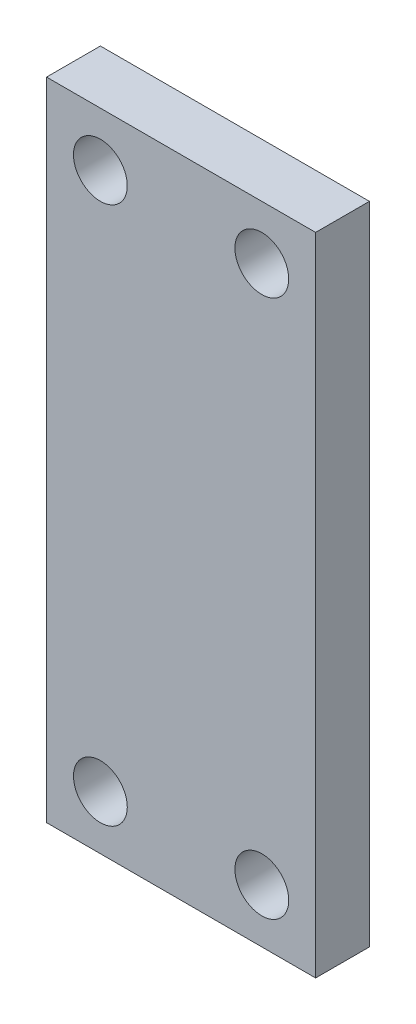
ISO-10303-21;
HEADER;
FILE_DESCRIPTION(('STEP AP214'),'2;1');
FILE_NAME('part.step','',(''),(''),'','','');
FILE_SCHEMA(('AUTOMOTIVE_DESIGN { 1 0 10303 214 1 1 1 1 }'));
ENDSEC;
DATA;
#1=APPLICATION_CONTEXT('core data for automotive mechanical design processes');
#2=APPLICATION_PROTOCOL_DEFINITION('international standard','automotive_design',2000,#1);
#3=PRODUCT_CONTEXT('',#1,'mechanical');
#4=PRODUCT('Part','Part','',(#3));
#5=PRODUCT_RELATED_PRODUCT_CATEGORY('part','',(#4));
#6=PRODUCT_DEFINITION_FORMATION('','',#4);
#7=PRODUCT_DEFINITION_CONTEXT('part definition',#1,'design');
#8=PRODUCT_DEFINITION('design','',#6,#7);
#9=PRODUCT_DEFINITION_SHAPE('','',#8);
#10=(LENGTH_UNIT() NAMED_UNIT(*) SI_UNIT(.MILLI.,.METRE.));
#11=(NAMED_UNIT(*) PLANE_ANGLE_UNIT() SI_UNIT($,.RADIAN.));
#12=(NAMED_UNIT(*) SI_UNIT($,.STERADIAN.) SOLID_ANGLE_UNIT());
#13=UNCERTAINTY_MEASURE_WITH_UNIT(LENGTH_MEASURE(1.E-05),#10,'distance_accuracy_value','');
#14=(GEOMETRIC_REPRESENTATION_CONTEXT(3) GLOBAL_UNCERTAINTY_ASSIGNED_CONTEXT((#13)) GLOBAL_UNIT_ASSIGNED_CONTEXT((#10,
#11,#12)) REPRESENTATION_CONTEXT('',''));
#15=CARTESIAN_POINT('',(0.,0.,0.));
#16=DIRECTION('',(0.,0.,1.));
#17=DIRECTION('',(1.,0.,0.));
#18=AXIS2_PLACEMENT_3D('',#15,#16,#17);
#19=CARTESIAN_POINT('',(0.,0.,5.));
#20=DIRECTION('',(0.,0.,-1.));
#21=DIRECTION('',(-1.,0.,0.));
#22=AXIS2_PLACEMENT_3D('',#19,#20,#21);
#23=PLANE('',#22);
#24=DIRECTION('',(0.,1.,0.));
#25=VECTOR('',#24,1.);
#26=CARTESIAN_POINT('',(12.5,-30.,5.));
#27=LINE('',#26,#25);
#28=CARTESIAN_POINT('',(12.5,-30.,5.));
#29=VERTEX_POINT('',#28);
#30=CARTESIAN_POINT('',(12.5,30.,5.));
#31=VERTEX_POINT('',#30);
#32=EDGE_CURVE('E92',#29,#31,#27,.T.);
#33=ORIENTED_EDGE('',*,*,#32,.T.);
#34=DIRECTION('',(-1.,0.,0.));
#35=VECTOR('',#34,1.);
#36=CARTESIAN_POINT('',(-12.5,30.,5.));
#37=LINE('',#36,#35);
#38=CARTESIAN_POINT('',(-12.5,30.,5.));
#39=VERTEX_POINT('',#38);
#40=EDGE_CURVE('E87',#31,#39,#37,.T.);
#41=ORIENTED_EDGE('',*,*,#40,.T.);
#42=DIRECTION('',(0.,-1.,0.));
#43=VECTOR('',#42,1.);
#44=CARTESIAN_POINT('',(-12.5,-30.,5.));
#45=LINE('',#44,#43);
#46=CARTESIAN_POINT('',(-12.5,-30.,5.));
#47=VERTEX_POINT('',#46);
#48=EDGE_CURVE('E90',#39,#47,#45,.T.);
#49=ORIENTED_EDGE('',*,*,#48,.T.);
#50=DIRECTION('',(1.,0.,0.));
#51=VECTOR('',#50,1.);
#52=CARTESIAN_POINT('',(-12.5,-30.,5.));
#53=LINE('',#52,#51);
#54=EDGE_CURVE('E57',#47,#29,#53,.T.);
#55=ORIENTED_EDGE('',*,*,#54,.T.);
#56=EDGE_LOOP('',(#33,#41,#49,#55));
#57=FACE_BOUND('',#56,.T.);
#58=CARTESIAN_POINT('',(7.5,25.,5.));
#59=DIRECTION('',(0.,0.,1.));
#60=DIRECTION('',(1.,0.,0.));
#61=AXIS2_PLACEMENT_3D('',#58,#59,#60);
#62=CIRCLE('',#61,2.5);
#63=CARTESIAN_POINT('',(10.,25.,5.));
#64=VERTEX_POINT('',#63);
#65=EDGE_CURVE('E112',#64,#64,#62,.T.);
#66=ORIENTED_EDGE('',*,*,#65,.F.);
#67=EDGE_LOOP('',(#66));
#68=FACE_BOUND('',#67,.T.);
#69=CARTESIAN_POINT('',(-7.5,25.,5.));
#70=DIRECTION('',(0.,0.,1.));
#71=DIRECTION('',(-1.,0.,0.));
#72=AXIS2_PLACEMENT_3D('',#69,#70,#71);
#73=CIRCLE('',#72,2.5);
#74=CARTESIAN_POINT('',(-10.,25.,5.));
#75=VERTEX_POINT('',#74);
#76=EDGE_CURVE('E134',#75,#75,#73,.T.);
#77=ORIENTED_EDGE('',*,*,#76,.F.);
#78=EDGE_LOOP('',(#77));
#79=FACE_BOUND('',#78,.T.);
#80=CARTESIAN_POINT('',(7.49999999999999,-25.,5.));
#81=DIRECTION('',(0.,0.,1.));
#82=DIRECTION('',(-1.,0.,0.));
#83=AXIS2_PLACEMENT_3D('',#80,#81,#82);
#84=CIRCLE('',#83,2.5);
#85=CARTESIAN_POINT('',(4.99999999999999,-25.,5.));
#86=VERTEX_POINT('',#85);
#87=EDGE_CURVE('E142',#86,#86,#84,.T.);
#88=ORIENTED_EDGE('',*,*,#87,.F.);
#89=EDGE_LOOP('',(#88));
#90=FACE_BOUND('',#89,.T.);
#91=CARTESIAN_POINT('',(-7.50000000000001,-25.,5.));
#92=DIRECTION('',(0.,0.,1.));
#93=DIRECTION('',(1.,0.,0.));
#94=AXIS2_PLACEMENT_3D('',#91,#92,#93);
#95=CIRCLE('',#94,2.5);
#96=CARTESIAN_POINT('',(-5.00000000000001,-25.,5.));
#97=VERTEX_POINT('',#96);
#98=EDGE_CURVE('E150',#97,#97,#95,.T.);
#99=ORIENTED_EDGE('',*,*,#98,.F.);
#100=EDGE_LOOP('',(#99));
#101=FACE_BOUND('',#100,.T.);
#102=ADVANCED_FACE('F39',(#57,#68,#79,#90,#101),#23,.F.);
#103=CARTESIAN_POINT('',(0.,0.,0.));
#104=DIRECTION('',(0.,0.,-1.));
#105=DIRECTION('',(-1.,0.,0.));
#106=AXIS2_PLACEMENT_3D('',#103,#104,#105);
#107=PLANE('',#106);
#108=CARTESIAN_POINT('',(7.49999999999999,-25.,0.));
#109=DIRECTION('',(0.,0.,1.));
#110=DIRECTION('',(-1.,0.,0.));
#111=AXIS2_PLACEMENT_3D('',#108,#109,#110);
#112=CIRCLE('',#111,2.5);
#113=CARTESIAN_POINT('',(4.99999999999999,-25.,0.));
#114=VERTEX_POINT('',#113);
#115=EDGE_CURVE('E146',#114,#114,#112,.T.);
#116=ORIENTED_EDGE('',*,*,#115,.T.);
#117=EDGE_LOOP('',(#116));
#118=FACE_BOUND('',#117,.T.);
#119=CARTESIAN_POINT('',(7.5,25.,0.));
#120=DIRECTION('',(0.,0.,1.));
#121=DIRECTION('',(1.,0.,0.));
#122=AXIS2_PLACEMENT_3D('',#119,#120,#121);
#123=CIRCLE('',#122,2.5);
#124=CARTESIAN_POINT('',(10.,25.,0.));
#125=VERTEX_POINT('',#124);
#126=EDGE_CURVE('E130',#125,#125,#123,.T.);
#127=ORIENTED_EDGE('',*,*,#126,.T.);
#128=EDGE_LOOP('',(#127));
#129=FACE_BOUND('',#128,.T.);
#130=DIRECTION('',(0.,1.,0.));
#131=VECTOR('',#130,1.);
#132=CARTESIAN_POINT('',(12.5,-30.,0.));
#133=LINE('',#132,#131);
#134=CARTESIAN_POINT('',(12.5,-30.,0.));
#135=VERTEX_POINT('',#134);
#136=CARTESIAN_POINT('',(12.5,30.,0.));
#137=VERTEX_POINT('',#136);
#138=EDGE_CURVE('E108',#135,#137,#133,.T.);
#139=ORIENTED_EDGE('',*,*,#138,.F.);
#140=DIRECTION('',(1.,0.,0.));
#141=VECTOR('',#140,1.);
#142=CARTESIAN_POINT('',(-12.5,-30.,0.));
#143=LINE('',#142,#141);
#144=CARTESIAN_POINT('',(-12.5,-30.,0.));
#145=VERTEX_POINT('',#144);
#146=EDGE_CURVE('E80',#145,#135,#143,.T.);
#147=ORIENTED_EDGE('',*,*,#146,.F.);
#148=DIRECTION('',(0.,-1.,0.));
#149=VECTOR('',#148,1.);
#150=CARTESIAN_POINT('',(-12.5,-30.,0.));
#151=LINE('',#150,#149);
#152=CARTESIAN_POINT('',(-12.5,30.,0.));
#153=VERTEX_POINT('',#152);
#154=EDGE_CURVE('E74',#153,#145,#151,.T.);
#155=ORIENTED_EDGE('',*,*,#154,.F.);
#156=DIRECTION('',(-1.,0.,0.));
#157=VECTOR('',#156,1.);
#158=CARTESIAN_POINT('',(-12.5,30.,0.));
#159=LINE('',#158,#157);
#160=EDGE_CURVE('E97',#137,#153,#159,.T.);
#161=ORIENTED_EDGE('',*,*,#160,.F.);
#162=EDGE_LOOP('',(#139,#147,#155,#161));
#163=FACE_BOUND('',#162,.T.);
#164=CARTESIAN_POINT('',(-7.5,25.,0.));
#165=DIRECTION('',(0.,0.,1.));
#166=DIRECTION('',(-1.,0.,0.));
#167=AXIS2_PLACEMENT_3D('',#164,#165,#166);
#168=CIRCLE('',#167,2.5);
#169=CARTESIAN_POINT('',(-10.,25.,0.));
#170=VERTEX_POINT('',#169);
#171=EDGE_CURVE('E138',#170,#170,#168,.T.);
#172=ORIENTED_EDGE('',*,*,#171,.T.);
#173=EDGE_LOOP('',(#172));
#174=FACE_BOUND('',#173,.T.);
#175=CARTESIAN_POINT('',(-7.50000000000001,-25.,0.));
#176=DIRECTION('',(0.,0.,1.));
#177=DIRECTION('',(1.,0.,0.));
#178=AXIS2_PLACEMENT_3D('',#175,#176,#177);
#179=CIRCLE('',#178,2.5);
#180=CARTESIAN_POINT('',(-5.00000000000001,-25.,0.));
#181=VERTEX_POINT('',#180);
#182=EDGE_CURVE('E154',#181,#181,#179,.T.);
#183=ORIENTED_EDGE('',*,*,#182,.T.);
#184=EDGE_LOOP('',(#183));
#185=FACE_BOUND('',#184,.T.);
#186=ADVANCED_FACE('F125',(#118,#129,#163,#174,#185),#107,.T.);
#187=CARTESIAN_POINT('',(12.5,-30.,5.));
#188=DIRECTION('',(-1.,0.,0.));
#189=DIRECTION('',(0.,0.,1.));
#190=AXIS2_PLACEMENT_3D('',#187,#188,#189);
#191=PLANE('',#190);
#192=ORIENTED_EDGE('',*,*,#138,.T.);
#193=DIRECTION('',(0.,0.,-1.));
#194=VECTOR('',#193,1.);
#195=CARTESIAN_POINT('',(12.5,30.,5.));
#196=LINE('',#195,#194);
#197=EDGE_CURVE('E11',#31,#137,#196,.T.);
#198=ORIENTED_EDGE('',*,*,#197,.F.);
#199=ORIENTED_EDGE('',*,*,#32,.F.);
#200=DIRECTION('',(0.,0.,-1.));
#201=VECTOR('',#200,1.);
#202=CARTESIAN_POINT('',(12.5,-30.,5.));
#203=LINE('',#202,#201);
#204=EDGE_CURVE('E104',#29,#135,#203,.T.);
#205=ORIENTED_EDGE('',*,*,#204,.T.);
#206=EDGE_LOOP('',(#192,#198,#199,#205));
#207=FACE_BOUND('',#206,.T.);
#208=ADVANCED_FACE('F41',(#207),#191,.F.);
#209=CARTESIAN_POINT('',(-12.5,30.,5.));
#210=DIRECTION('',(0.,-1.,0.));
#211=DIRECTION('',(0.,0.,-1.));
#212=AXIS2_PLACEMENT_3D('',#209,#210,#211);
#213=PLANE('',#212);
#214=ORIENTED_EDGE('',*,*,#160,.T.);
#215=DIRECTION('',(0.,0.,-1.));
#216=VECTOR('',#215,1.);
#217=CARTESIAN_POINT('',(-12.5,30.,5.));
#218=LINE('',#217,#216);
#219=EDGE_CURVE('E49',#39,#153,#218,.T.);
#220=ORIENTED_EDGE('',*,*,#219,.F.);
#221=ORIENTED_EDGE('',*,*,#40,.F.);
#222=ORIENTED_EDGE('',*,*,#197,.T.);
#223=EDGE_LOOP('',(#214,#220,#221,#222));
#224=FACE_BOUND('',#223,.T.);
#225=ADVANCED_FACE('F96',(#224),#213,.F.);
#226=CARTESIAN_POINT('',(-12.5,-30.,5.));
#227=DIRECTION('',(1.,0.,0.));
#228=DIRECTION('',(0.,0.,-1.));
#229=AXIS2_PLACEMENT_3D('',#226,#227,#228);
#230=PLANE('',#229);
#231=ORIENTED_EDGE('',*,*,#154,.T.);
#232=DIRECTION('',(0.,0.,-1.));
#233=VECTOR('',#232,1.);
#234=CARTESIAN_POINT('',(-12.5,-30.,5.));
#235=LINE('',#234,#233);
#236=EDGE_CURVE('E99',#47,#145,#235,.T.);
#237=ORIENTED_EDGE('',*,*,#236,.F.);
#238=ORIENTED_EDGE('',*,*,#48,.F.);
#239=ORIENTED_EDGE('',*,*,#219,.T.);
#240=EDGE_LOOP('',(#231,#237,#238,#239));
#241=FACE_BOUND('',#240,.T.);
#242=ADVANCED_FACE('F100',(#241),#230,.F.);
#243=CARTESIAN_POINT('',(-12.5,-30.,5.));
#244=DIRECTION('',(0.,1.,0.));
#245=DIRECTION('',(0.,0.,1.));
#246=AXIS2_PLACEMENT_3D('',#243,#244,#245);
#247=PLANE('',#246);
#248=ORIENTED_EDGE('',*,*,#146,.T.);
#249=ORIENTED_EDGE('',*,*,#204,.F.);
#250=ORIENTED_EDGE('',*,*,#54,.F.);
#251=ORIENTED_EDGE('',*,*,#236,.T.);
#252=EDGE_LOOP('',(#248,#249,#250,#251));
#253=FACE_BOUND('',#252,.T.);
#254=ADVANCED_FACE('F122',(#253),#247,.F.);
#255=CARTESIAN_POINT('',(7.5,25.,5.));
#256=DIRECTION('',(0.,0.,-1.));
#257=DIRECTION('',(-1.,0.,0.));
#258=AXIS2_PLACEMENT_3D('',#255,#256,#257);
#259=CYLINDRICAL_SURFACE('',#258,2.5);
#260=ORIENTED_EDGE('',*,*,#65,.T.);
#261=EDGE_LOOP('',(#260));
#262=FACE_BOUND('',#261,.T.);
#263=ORIENTED_EDGE('',*,*,#126,.F.);
#264=EDGE_LOOP('',(#263));
#265=FACE_BOUND('',#264,.T.);
#266=ADVANCED_FACE('F173',(#262,#265),#259,.F.);
#267=CARTESIAN_POINT('',(-7.5,25.,5.));
#268=DIRECTION('',(0.,0.,-1.));
#269=DIRECTION('',(-1.,0.,0.));
#270=AXIS2_PLACEMENT_3D('',#267,#268,#269);
#271=CYLINDRICAL_SURFACE('',#270,2.5);
#272=ORIENTED_EDGE('',*,*,#76,.T.);
#273=EDGE_LOOP('',(#272));
#274=FACE_BOUND('',#273,.T.);
#275=ORIENTED_EDGE('',*,*,#171,.F.);
#276=EDGE_LOOP('',(#275));
#277=FACE_BOUND('',#276,.T.);
#278=ADVANCED_FACE('F219',(#274,#277),#271,.F.);
#279=CARTESIAN_POINT('',(7.49999999999999,-25.,5.));
#280=DIRECTION('',(0.,0.,-1.));
#281=DIRECTION('',(-1.,0.,0.));
#282=AXIS2_PLACEMENT_3D('',#279,#280,#281);
#283=CYLINDRICAL_SURFACE('',#282,2.5);
#284=ORIENTED_EDGE('',*,*,#87,.T.);
#285=EDGE_LOOP('',(#284));
#286=FACE_BOUND('',#285,.T.);
#287=ORIENTED_EDGE('',*,*,#115,.F.);
#288=EDGE_LOOP('',(#287));
#289=FACE_BOUND('',#288,.T.);
#290=ADVANCED_FACE('F227',(#286,#289),#283,.F.);
#291=CARTESIAN_POINT('',(-7.50000000000001,-25.,5.));
#292=DIRECTION('',(0.,0.,-1.));
#293=DIRECTION('',(-1.,0.,0.));
#294=AXIS2_PLACEMENT_3D('',#291,#292,#293);
#295=CYLINDRICAL_SURFACE('',#294,2.5);
#296=ORIENTED_EDGE('',*,*,#98,.T.);
#297=EDGE_LOOP('',(#296));
#298=FACE_BOUND('',#297,.T.);
#299=ORIENTED_EDGE('',*,*,#182,.F.);
#300=EDGE_LOOP('',(#299));
#301=FACE_BOUND('',#300,.T.);
#302=ADVANCED_FACE('F162',(#298,#301),#295,.F.);
#303=CLOSED_SHELL('',(#102,#186,#208,#225,#242,#254,#266,#278,#290,#302));
#304=MANIFOLD_SOLID_BREP('B2',#303);
#305=ADVANCED_BREP_SHAPE_REPRESENTATION('',(#18,#304),#14);
#306=SHAPE_DEFINITION_REPRESENTATION(#9,#305);
ENDSEC;
END-ISO-10303-21;
